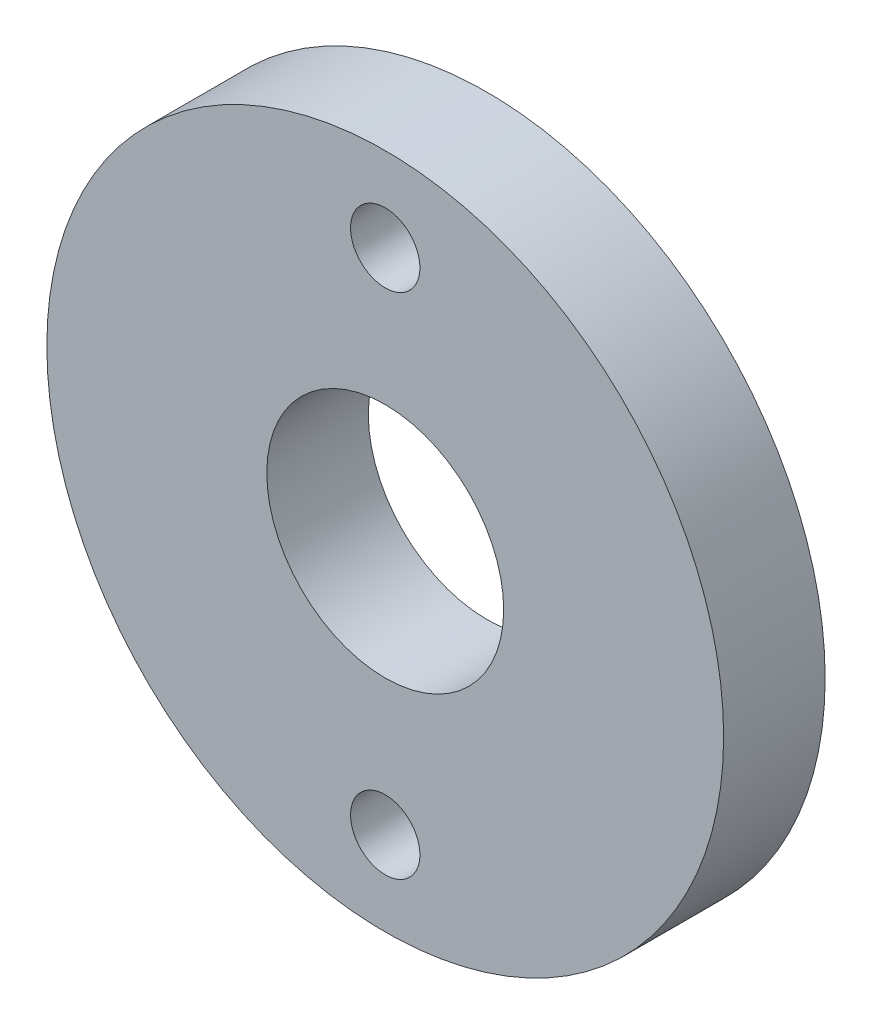
ISO-10303-21;
HEADER;
FILE_DESCRIPTION(('STEP AP214'),'2;1');
FILE_NAME('part.step','',(''),(''),'','','');
FILE_SCHEMA(('AUTOMOTIVE_DESIGN { 1 0 10303 214 1 1 1 1 }'));
ENDSEC;
DATA;
#1=APPLICATION_CONTEXT('core data for automotive mechanical design processes');
#2=APPLICATION_PROTOCOL_DEFINITION('international standard','automotive_design',2000,#1);
#3=PRODUCT_CONTEXT('',#1,'mechanical');
#4=PRODUCT('Part','Part','',(#3));
#5=PRODUCT_RELATED_PRODUCT_CATEGORY('part','',(#4));
#6=PRODUCT_DEFINITION_FORMATION('','',#4);
#7=PRODUCT_DEFINITION_CONTEXT('part definition',#1,'design');
#8=PRODUCT_DEFINITION('design','',#6,#7);
#9=PRODUCT_DEFINITION_SHAPE('','',#8);
#10=(LENGTH_UNIT() NAMED_UNIT(*) SI_UNIT(.MILLI.,.METRE.));
#11=(NAMED_UNIT(*) PLANE_ANGLE_UNIT() SI_UNIT($,.RADIAN.));
#12=(NAMED_UNIT(*) SI_UNIT($,.STERADIAN.) SOLID_ANGLE_UNIT());
#13=UNCERTAINTY_MEASURE_WITH_UNIT(LENGTH_MEASURE(1.E-05),#10,'distance_accuracy_value','');
#14=(GEOMETRIC_REPRESENTATION_CONTEXT(3) GLOBAL_UNCERTAINTY_ASSIGNED_CONTEXT((#13)) GLOBAL_UNIT_ASSIGNED_CONTEXT((#10,
#11,#12)) REPRESENTATION_CONTEXT('',''));
#15=CARTESIAN_POINT('',(0.,0.,0.));
#16=DIRECTION('',(0.,0.,1.));
#17=DIRECTION('',(1.,0.,0.));
#18=AXIS2_PLACEMENT_3D('',#15,#16,#17);
#19=CARTESIAN_POINT('',(0.,0.,3.));
#20=DIRECTION('',(0.,0.,-1.));
#21=DIRECTION('',(-1.,0.,0.));
#22=AXIS2_PLACEMENT_3D('',#19,#20,#21);
#23=CYLINDRICAL_SURFACE('',#22,10.);
#24=CARTESIAN_POINT('',(0.,0.,3.));
#25=DIRECTION('',(0.,0.,1.));
#26=DIRECTION('',(1.,0.,0.));
#27=AXIS2_PLACEMENT_3D('',#24,#25,#26);
#28=CIRCLE('',#27,10.);
#29=CARTESIAN_POINT('',(10.,0.,3.));
#30=VERTEX_POINT('',#29);
#31=EDGE_CURVE('E10',#30,#30,#28,.T.);
#32=ORIENTED_EDGE('',*,*,#31,.F.);
#33=EDGE_LOOP('',(#32));
#34=FACE_BOUND('',#33,.T.);
#35=CARTESIAN_POINT('',(0.,0.,0.));
#36=DIRECTION('',(0.,0.,1.));
#37=DIRECTION('',(1.,0.,0.));
#38=AXIS2_PLACEMENT_3D('',#35,#36,#37);
#39=CIRCLE('',#38,10.);
#40=CARTESIAN_POINT('',(10.,0.,0.));
#41=VERTEX_POINT('',#40);
#42=EDGE_CURVE('E36',#41,#41,#39,.T.);
#43=ORIENTED_EDGE('',*,*,#42,.T.);
#44=EDGE_LOOP('',(#43));
#45=FACE_BOUND('',#44,.T.);
#46=ADVANCED_FACE('F33',(#34,#45),#23,.T.);
#47=CARTESIAN_POINT('',(0.,0.,3.));
#48=DIRECTION('',(0.,0.,1.));
#49=DIRECTION('',(1.,0.,0.));
#50=AXIS2_PLACEMENT_3D('',#47,#48,#49);
#51=PLANE('',#50);
#52=CARTESIAN_POINT('',(0.,0.,3.));
#53=DIRECTION('',(0.,0.,1.));
#54=DIRECTION('',(1.,0.,0.));
#55=AXIS2_PLACEMENT_3D('',#52,#53,#54);
#56=CIRCLE('',#55,3.5);
#57=CARTESIAN_POINT('',(3.5,0.,3.));
#58=VERTEX_POINT('',#57);
#59=EDGE_CURVE('E57',#58,#58,#56,.T.);
#60=ORIENTED_EDGE('',*,*,#59,.F.);
#61=EDGE_LOOP('',(#60));
#62=FACE_BOUND('',#61,.T.);
#63=CARTESIAN_POINT('',(0.,-7.51,3.));
#64=DIRECTION('',(0.,0.,1.));
#65=DIRECTION('',(1.,0.,0.));
#66=AXIS2_PLACEMENT_3D('',#63,#64,#65);
#67=CIRCLE('',#66,1.025);
#68=CARTESIAN_POINT('',(1.025,-7.51,3.));
#69=VERTEX_POINT('',#68);
#70=EDGE_CURVE('E51',#69,#69,#67,.T.);
#71=ORIENTED_EDGE('',*,*,#70,.F.);
#72=EDGE_LOOP('',(#71));
#73=FACE_BOUND('',#72,.T.);
#74=CARTESIAN_POINT('',(0.,7.51,3.));
#75=DIRECTION('',(0.,0.,1.));
#76=DIRECTION('',(1.,0.,0.));
#77=AXIS2_PLACEMENT_3D('',#74,#75,#76);
#78=CIRCLE('',#77,1.025);
#79=CARTESIAN_POINT('',(1.025,7.51,3.));
#80=VERTEX_POINT('',#79);
#81=EDGE_CURVE('E45',#80,#80,#78,.T.);
#82=ORIENTED_EDGE('',*,*,#81,.F.);
#83=EDGE_LOOP('',(#82));
#84=FACE_BOUND('',#83,.T.);
#85=ORIENTED_EDGE('',*,*,#31,.T.);
#86=EDGE_LOOP('',(#85));
#87=FACE_BOUND('',#86,.T.);
#88=ADVANCED_FACE('F73',(#62,#73,#84,#87),#51,.T.);
#89=CARTESIAN_POINT('',(0.,0.,0.));
#90=DIRECTION('',(0.,0.,1.));
#91=DIRECTION('',(1.,0.,0.));
#92=AXIS2_PLACEMENT_3D('',#89,#90,#91);
#93=PLANE('',#92);
#94=CARTESIAN_POINT('',(0.,0.,0.));
#95=DIRECTION('',(0.,0.,1.));
#96=DIRECTION('',(1.,0.,0.));
#97=AXIS2_PLACEMENT_3D('',#94,#95,#96);
#98=CIRCLE('',#97,3.5);
#99=CARTESIAN_POINT('',(3.5,0.,0.));
#100=VERTEX_POINT('',#99);
#101=EDGE_CURVE('E54',#100,#100,#98,.T.);
#102=ORIENTED_EDGE('',*,*,#101,.T.);
#103=EDGE_LOOP('',(#102));
#104=FACE_BOUND('',#103,.T.);
#105=CARTESIAN_POINT('',(0.,-7.51,0.));
#106=DIRECTION('',(0.,0.,1.));
#107=DIRECTION('',(1.,0.,0.));
#108=AXIS2_PLACEMENT_3D('',#105,#106,#107);
#109=CIRCLE('',#108,1.025);
#110=CARTESIAN_POINT('',(1.025,-7.51,0.));
#111=VERTEX_POINT('',#110);
#112=EDGE_CURVE('E48',#111,#111,#109,.T.);
#113=ORIENTED_EDGE('',*,*,#112,.T.);
#114=EDGE_LOOP('',(#113));
#115=FACE_BOUND('',#114,.T.);
#116=CARTESIAN_POINT('',(0.,7.51,0.));
#117=DIRECTION('',(0.,0.,1.));
#118=DIRECTION('',(1.,0.,0.));
#119=AXIS2_PLACEMENT_3D('',#116,#117,#118);
#120=CIRCLE('',#119,1.025);
#121=CARTESIAN_POINT('',(1.025,7.51,0.));
#122=VERTEX_POINT('',#121);
#123=EDGE_CURVE('E43',#122,#122,#120,.T.);
#124=ORIENTED_EDGE('',*,*,#123,.T.);
#125=EDGE_LOOP('',(#124));
#126=FACE_BOUND('',#125,.T.);
#127=ORIENTED_EDGE('',*,*,#42,.F.);
#128=EDGE_LOOP('',(#127));
#129=FACE_BOUND('',#128,.T.);
#130=ADVANCED_FACE('F63',(#104,#115,#126,#129),#93,.F.);
#131=CARTESIAN_POINT('',(0.,7.51,0.));
#132=DIRECTION('',(0.,0.,1.));
#133=DIRECTION('',(1.,0.,0.));
#134=AXIS2_PLACEMENT_3D('',#131,#132,#133);
#135=CYLINDRICAL_SURFACE('',#134,1.025);
#136=ORIENTED_EDGE('',*,*,#123,.F.);
#137=EDGE_LOOP('',(#136));
#138=FACE_BOUND('',#137,.T.);
#139=ORIENTED_EDGE('',*,*,#81,.T.);
#140=EDGE_LOOP('',(#139));
#141=FACE_BOUND('',#140,.T.);
#142=ADVANCED_FACE('F81',(#138,#141),#135,.F.);
#143=CARTESIAN_POINT('',(0.,-7.51,0.));
#144=DIRECTION('',(0.,0.,1.));
#145=DIRECTION('',(1.,0.,0.));
#146=AXIS2_PLACEMENT_3D('',#143,#144,#145);
#147=CYLINDRICAL_SURFACE('',#146,1.025);
#148=ORIENTED_EDGE('',*,*,#112,.F.);
#149=EDGE_LOOP('',(#148));
#150=FACE_BOUND('',#149,.T.);
#151=ORIENTED_EDGE('',*,*,#70,.T.);
#152=EDGE_LOOP('',(#151));
#153=FACE_BOUND('',#152,.T.);
#154=ADVANCED_FACE('F69',(#150,#153),#147,.F.);
#155=CARTESIAN_POINT('',(0.,0.,0.));
#156=DIRECTION('',(0.,0.,1.));
#157=DIRECTION('',(1.,0.,0.));
#158=AXIS2_PLACEMENT_3D('',#155,#156,#157);
#159=CYLINDRICAL_SURFACE('',#158,3.5);
#160=ORIENTED_EDGE('',*,*,#101,.F.);
#161=EDGE_LOOP('',(#160));
#162=FACE_BOUND('',#161,.T.);
#163=ORIENTED_EDGE('',*,*,#59,.T.);
#164=EDGE_LOOP('',(#163));
#165=FACE_BOUND('',#164,.T.);
#166=ADVANCED_FACE('F66',(#162,#165),#159,.F.);
#167=CLOSED_SHELL('',(#46,#88,#130,#142,#154,#166));
#168=MANIFOLD_SOLID_BREP('B2',#167);
#169=ADVANCED_BREP_SHAPE_REPRESENTATION('',(#18,#168),#14);
#170=SHAPE_DEFINITION_REPRESENTATION(#9,#169);
ENDSEC;
END-ISO-10303-21;
